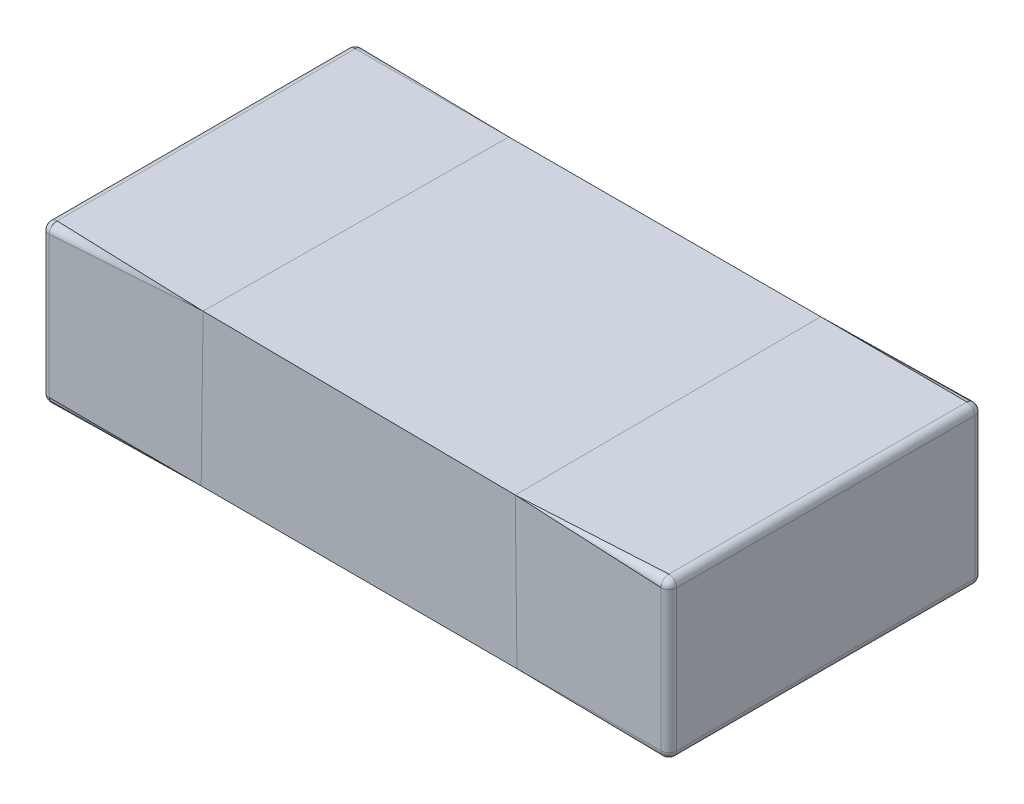
ISO-10303-21;
HEADER;
FILE_DESCRIPTION(('STEP AP214'),'2;1');
FILE_NAME('part.step','',(''),(''),'','','');
FILE_SCHEMA(('AUTOMOTIVE_DESIGN { 1 0 10303 214 1 1 1 1 }'));
ENDSEC;
DATA;
#1=APPLICATION_CONTEXT('core data for automotive mechanical design processes');
#2=APPLICATION_PROTOCOL_DEFINITION('international standard','automotive_design',2000,#1);
#3=PRODUCT_CONTEXT('',#1,'mechanical');
#4=PRODUCT('Part','Part','',(#3));
#5=PRODUCT_RELATED_PRODUCT_CATEGORY('part','',(#4));
#6=PRODUCT_DEFINITION_FORMATION('','',#4);
#7=PRODUCT_DEFINITION_CONTEXT('part definition',#1,'design');
#8=PRODUCT_DEFINITION('design','',#6,#7);
#9=PRODUCT_DEFINITION_SHAPE('','',#8);
#10=(LENGTH_UNIT() NAMED_UNIT(*) SI_UNIT(.MILLI.,.METRE.));
#11=(NAMED_UNIT(*) PLANE_ANGLE_UNIT() SI_UNIT($,.RADIAN.));
#12=(NAMED_UNIT(*) SI_UNIT($,.STERADIAN.) SOLID_ANGLE_UNIT());
#13=UNCERTAINTY_MEASURE_WITH_UNIT(LENGTH_MEASURE(1.E-05),#10,'distance_accuracy_value','');
#14=(GEOMETRIC_REPRESENTATION_CONTEXT(3) GLOBAL_UNCERTAINTY_ASSIGNED_CONTEXT((#13)) GLOBAL_UNIT_ASSIGNED_CONTEXT((#10,
#11,#12)) REPRESENTATION_CONTEXT('',''));
#15=CARTESIAN_POINT('',(0.,0.,0.));
#16=DIRECTION('',(0.,0.,1.));
#17=DIRECTION('',(1.,0.,0.));
#18=AXIS2_PLACEMENT_3D('',#15,#16,#17);
#19=CARTESIAN_POINT('',(0.4,0.,0.));
#20=DIRECTION('',(0.,0.,-1.));
#21=DIRECTION('',(-1.,0.,0.));
#22=AXIS2_PLACEMENT_3D('',#19,#20,#21);
#23=PLANE('',#22);
#24=DIRECTION('',(0.,-1.,0.));
#25=VECTOR('',#24,1.);
#26=CARTESIAN_POINT('',(0.02,0.,0.));
#27=LINE('',#26,#25);
#28=CARTESIAN_POINT('',(0.02,0.38,0.));
#29=VERTEX_POINT('',#28);
#30=CARTESIAN_POINT('',(0.02,0.02,0.));
#31=VERTEX_POINT('',#30);
#32=EDGE_CURVE('E11',#29,#31,#27,.T.);
#33=ORIENTED_EDGE('',*,*,#32,.T.);
#34=DIRECTION('',(1.,0.,0.));
#35=VECTOR('',#34,1.);
#36=CARTESIAN_POINT('',(0.4,0.02,0.));
#37=LINE('',#36,#35);
#38=CARTESIAN_POINT('',(0.4,0.0109819967589767,-0.00744806470428807));
#39=VERTEX_POINT('',#38);
#40=EDGE_CURVE('E25',#31,#39,#37,.T.);
#41=ORIENTED_EDGE('',*,*,#40,.T.);
#42=CARTESIAN_POINT('',(0.4,0.394533907643487,-0.00678606963199358));
#43=CARTESIAN_POINT('',(0.4,0.263741140957794,-0.00678606963199358));
#44=CARTESIAN_POINT('',(0.4,0.135397492272508,-0.00678606963199358));
#45=CARTESIAN_POINT('',(0.4,0.0109819967589767,-0.00678606963199358));
#46=B_SPLINE_CURVE_WITH_KNOTS('',3,(#42,#43,#44,#45),.UNSPECIFIED.,.F.,.F.,(4,4),(0.,1.),.UNSPECIFIED.);
#47=CARTESIAN_POINT('',(0.4,0.394533907643487,-0.0123095617266977));
#48=VERTEX_POINT('',#47);
#49=EDGE_CURVE('E522',#48,#39,#46,.T.);
#50=ORIENTED_EDGE('',*,*,#49,.F.);
#51=DIRECTION('',(-1.,0.,0.));
#52=VECTOR('',#51,1.);
#53=CARTESIAN_POINT('',(0.4,0.38,0.));
#54=LINE('',#53,#52);
#55=EDGE_CURVE('E37',#48,#29,#54,.T.);
#56=ORIENTED_EDGE('',*,*,#55,.T.);
#57=EDGE_LOOP('',(#33,#41,#50,#56));
#58=FACE_BOUND('',#57,.T.);
#59=ADVANCED_FACE('F17',(#58),#23,.F.);
#60=CARTESIAN_POINT('',(0.4,0.,0.));
#61=DIRECTION('',(0.,1.,0.));
#62=DIRECTION('',(0.,0.,1.));
#63=AXIS2_PLACEMENT_3D('',#60,#61,#62);
#64=PLANE('',#63);
#65=DIRECTION('',(0.,0.,-1.));
#66=VECTOR('',#65,1.);
#67=CARTESIAN_POINT('',(0.02,0.,-0.8));
#68=LINE('',#67,#66);
#69=CARTESIAN_POINT('',(0.02,0.,-0.02));
#70=VERTEX_POINT('',#69);
#71=CARTESIAN_POINT('',(0.02,0.,-0.78));
#72=VERTEX_POINT('',#71);
#73=EDGE_CURVE('E894',#70,#72,#68,.T.);
#74=ORIENTED_EDGE('',*,*,#73,.T.);
#75=DIRECTION('',(1.,0.,0.));
#76=VECTOR('',#75,1.);
#77=CARTESIAN_POINT('',(0.4,0.,-0.78));
#78=LINE('',#77,#76);
#79=CARTESIAN_POINT('',(0.4,0.00711261616325524,-0.78841510535834));
#80=VERTEX_POINT('',#79);
#81=EDGE_CURVE('E536',#72,#80,#78,.T.);
#82=ORIENTED_EDGE('',*,*,#81,.T.);
#83=CARTESIAN_POINT('',(0.4,0.00705384358722266,-0.00744806470428807));
#84=CARTESIAN_POINT('',(0.4,0.00705384358722266,-0.268354445364198));
#85=CARTESIAN_POINT('',(0.4,0.00705384358722266,-0.529922821096402));
#86=CARTESIAN_POINT('',(0.4,0.00705384358722266,-0.78841510535834));
#87=B_SPLINE_CURVE_WITH_KNOTS('',3,(#83,#84,#85,#86),.UNSPECIFIED.,.F.,.F.,(4,4),(0.,1.),.UNSPECIFIED.);
#88=EDGE_CURVE('E530',#39,#80,#87,.T.);
#89=ORIENTED_EDGE('',*,*,#88,.F.);
#90=DIRECTION('',(-1.,0.,0.));
#91=VECTOR('',#90,1.);
#92=CARTESIAN_POINT('',(0.4,0.,-0.02));
#93=LINE('',#92,#91);
#94=EDGE_CURVE('E524',#39,#70,#93,.T.);
#95=ORIENTED_EDGE('',*,*,#94,.T.);
#96=EDGE_LOOP('',(#74,#82,#89,#95));
#97=FACE_BOUND('',#96,.T.);
#98=ADVANCED_FACE('F335',(#97),#64,.F.);
#99=CARTESIAN_POINT('',(0.4,0.,-0.8));
#100=DIRECTION('',(0.,0.,1.));
#101=DIRECTION('',(1.,0.,0.));
#102=AXIS2_PLACEMENT_3D('',#99,#100,#101);
#103=PLANE('',#102);
#104=DIRECTION('',(0.,1.,0.));
#105=VECTOR('',#104,1.);
#106=CARTESIAN_POINT('',(0.02,0.4,-0.8));
#107=LINE('',#106,#105);
#108=CARTESIAN_POINT('',(0.02,0.02,-0.8));
#109=VERTEX_POINT('',#108);
#110=CARTESIAN_POINT('',(0.02,0.38,-0.8));
#111=VERTEX_POINT('',#110);
#112=EDGE_CURVE('E531',#109,#111,#107,.T.);
#113=ORIENTED_EDGE('',*,*,#112,.T.);
#114=DIRECTION('',(1.,0.,0.));
#115=VECTOR('',#114,1.);
#116=CARTESIAN_POINT('',(0.4,0.38,-0.8));
#117=LINE('',#116,#115);
#118=CARTESIAN_POINT('',(0.4,0.389276094232919,-0.792025572215316));
#119=VERTEX_POINT('',#118);
#120=EDGE_CURVE('E921',#111,#119,#117,.T.);
#121=ORIENTED_EDGE('',*,*,#120,.T.);
#122=CARTESIAN_POINT('',(0.4,0.00711261616325522,-0.791491196828607));
#123=CARTESIAN_POINT('',(0.4,0.135397492272508,-0.791491196828607));
#124=CARTESIAN_POINT('',(0.4,0.263741140957794,-0.791491196828607));
#125=CARTESIAN_POINT('',(0.4,0.389276094232919,-0.791491196828607));
#126=B_SPLINE_CURVE_WITH_KNOTS('',3,(#122,#123,#124,#125),.UNSPECIFIED.,.F.,.F.,(4,4),(0.,1.),.UNSPECIFIED.);
#127=EDGE_CURVE('E353',#80,#119,#126,.T.);
#128=ORIENTED_EDGE('',*,*,#127,.F.);
#129=DIRECTION('',(-1.,0.,0.));
#130=VECTOR('',#129,1.);
#131=CARTESIAN_POINT('',(0.4,0.02,-0.8));
#132=LINE('',#131,#130);
#133=EDGE_CURVE('E343',#80,#109,#132,.T.);
#134=ORIENTED_EDGE('',*,*,#133,.T.);
#135=EDGE_LOOP('',(#113,#121,#128,#134));
#136=FACE_BOUND('',#135,.T.);
#137=ADVANCED_FACE('F330',(#136),#103,.F.);
#138=CARTESIAN_POINT('',(0.4,0.4,0.));
#139=DIRECTION('',(0.,-1.,0.));
#140=DIRECTION('',(0.,0.,-1.));
#141=AXIS2_PLACEMENT_3D('',#138,#139,#140);
#142=PLANE('',#141);
#143=CARTESIAN_POINT('',(0.4,0.39208478964308,-0.792025572215316));
#144=CARTESIAN_POINT('',(0.4,0.39208478964308,-0.529922821096402));
#145=CARTESIAN_POINT('',(0.4,0.39208478964308,-0.268354445364198));
#146=CARTESIAN_POINT('',(0.4,0.39208478964308,-0.0123095617266977));
#147=B_SPLINE_CURVE_WITH_KNOTS('',3,(#143,#144,#145,#146),.UNSPECIFIED.,.F.,.F.,(4,4),(0.,1.),.UNSPECIFIED.);
#148=EDGE_CURVE('E312',#119,#48,#147,.T.);
#149=ORIENTED_EDGE('',*,*,#148,.F.);
#150=DIRECTION('',(-1.,0.,0.));
#151=VECTOR('',#150,1.);
#152=CARTESIAN_POINT('',(0.4,0.4,-0.78));
#153=LINE('',#152,#151);
#154=CARTESIAN_POINT('',(0.02,0.4,-0.78));
#155=VERTEX_POINT('',#154);
#156=EDGE_CURVE('E307',#119,#155,#153,.T.);
#157=ORIENTED_EDGE('',*,*,#156,.T.);
#158=DIRECTION('',(0.,0.,1.));
#159=VECTOR('',#158,1.);
#160=CARTESIAN_POINT('',(0.02,0.4,0.));
#161=LINE('',#160,#159);
#162=CARTESIAN_POINT('',(0.02,0.4,-0.02));
#163=VERTEX_POINT('',#162);
#164=EDGE_CURVE('E304',#155,#163,#161,.T.);
#165=ORIENTED_EDGE('',*,*,#164,.T.);
#166=DIRECTION('',(1.,0.,0.));
#167=VECTOR('',#166,1.);
#168=CARTESIAN_POINT('',(0.4,0.4,-0.02));
#169=LINE('',#168,#167);
#170=EDGE_CURVE('E299',#163,#48,#169,.T.);
#171=ORIENTED_EDGE('',*,*,#170,.T.);
#172=EDGE_LOOP('',(#149,#157,#165,#171));
#173=FACE_BOUND('',#172,.T.);
#174=ADVANCED_FACE('F319',(#173),#142,.F.);
#175=CARTESIAN_POINT('',(0.,0.4,0.));
#176=DIRECTION('',(-1.,0.,0.));
#177=DIRECTION('',(0.,0.,1.));
#178=AXIS2_PLACEMENT_3D('',#175,#176,#177);
#179=PLANE('',#178);
#180=DIRECTION('',(0.,-1.,0.));
#181=VECTOR('',#180,1.);
#182=CARTESIAN_POINT('',(0.,0.,-0.78));
#183=LINE('',#182,#181);
#184=CARTESIAN_POINT('',(0.,0.38,-0.78));
#185=VERTEX_POINT('',#184);
#186=CARTESIAN_POINT('',(0.,0.02,-0.78));
#187=VERTEX_POINT('',#186);
#188=EDGE_CURVE('E297',#185,#187,#183,.T.);
#189=ORIENTED_EDGE('',*,*,#188,.T.);
#190=DIRECTION('',(0.,0.,1.));
#191=VECTOR('',#190,1.);
#192=CARTESIAN_POINT('',(0.,0.02,0.));
#193=LINE('',#192,#191);
#194=CARTESIAN_POINT('',(0.,0.02,-0.02));
#195=VERTEX_POINT('',#194);
#196=EDGE_CURVE('E295',#187,#195,#193,.T.);
#197=ORIENTED_EDGE('',*,*,#196,.T.);
#198=DIRECTION('',(0.,1.,0.));
#199=VECTOR('',#198,1.);
#200=CARTESIAN_POINT('',(0.,0.4,-0.02));
#201=LINE('',#200,#199);
#202=CARTESIAN_POINT('',(0.,0.38,-0.02));
#203=VERTEX_POINT('',#202);
#204=EDGE_CURVE('E293',#195,#203,#201,.T.);
#205=ORIENTED_EDGE('',*,*,#204,.T.);
#206=DIRECTION('',(0.,0.,-1.));
#207=VECTOR('',#206,1.);
#208=CARTESIAN_POINT('',(0.,0.38,-0.8));
#209=LINE('',#208,#207);
#210=EDGE_CURVE('E290',#203,#185,#209,.T.);
#211=ORIENTED_EDGE('',*,*,#210,.T.);
#212=EDGE_LOOP('',(#189,#197,#205,#211));
#213=FACE_BOUND('',#212,.T.);
#214=ADVANCED_FACE('F329',(#213),#179,.T.);
#215=CARTESIAN_POINT('',(1.2,0.39208478964308,-0.00678606963199358));
#216=DIRECTION('',(0.,0.,-1.));
#217=DIRECTION('',(-1.,0.,0.));
#218=AXIS2_PLACEMENT_3D('',#215,#216,#217);
#219=PLANE('',#218);
#220=ORIENTED_EDGE('',*,*,#49,.T.);
#221=DIRECTION('',(1.,0.,0.));
#222=VECTOR('',#221,1.);
#223=CARTESIAN_POINT('',(1.2,0.00705384358722266,-0.00678606963199358));
#224=LINE('',#223,#222);
#225=CARTESIAN_POINT('',(1.2,0.00469186962900822,-0.0126718520652537));
#226=VERTEX_POINT('',#225);
#227=EDGE_CURVE('E288',#39,#226,#224,.T.);
#228=ORIENTED_EDGE('',*,*,#227,.T.);
#229=CARTESIAN_POINT('',(1.2,0.390383185381512,0.));
#230=CARTESIAN_POINT('',(1.2,0.260255456921008,0.));
#231=CARTESIAN_POINT('',(1.2,0.130127728460504,0.));
#232=CARTESIAN_POINT('',(1.2,0.00469186962900821,0.));
#233=B_SPLINE_CURVE_WITH_KNOTS('',3,(#229,#230,#231,#232),.UNSPECIFIED.,.F.,.F.,(4,4),
(0.0240420365462188,1.),.UNSPECIFIED.);
#234=CARTESIAN_POINT('',(1.2,0.390383185381513,-0.008354983209375));
#235=VERTEX_POINT('',#234);
#236=EDGE_CURVE('E284',#235,#226,#233,.T.);
#237=ORIENTED_EDGE('',*,*,#236,.F.);
#238=DIRECTION('',(1.,0.,0.));
#239=VECTOR('',#238,1.);
#240=CARTESIAN_POINT('',(1.2,0.39208478964308,-0.00678606963199358));
#241=LINE('',#240,#239);
#242=EDGE_CURVE('E479',#48,#235,#241,.T.);
#243=ORIENTED_EDGE('',*,*,#242,.F.);
#244=EDGE_LOOP('',(#220,#228,#237,#243));
#245=FACE_BOUND('',#244,.T.);
#246=ADVANCED_FACE('F546',(#245),#219,.F.);
#247=CARTESIAN_POINT('',(1.2,0.00705384358722266,-0.00678606963199358));
#248=DIRECTION('',(0.,1.,0.));
#249=DIRECTION('',(0.,0.,1.));
#250=AXIS2_PLACEMENT_3D('',#247,#248,#249);
#251=PLANE('',#250);
#252=ORIENTED_EDGE('',*,*,#88,.T.);
#253=DIRECTION('',(1.,0.,0.));
#254=VECTOR('',#253,1.);
#255=CARTESIAN_POINT('',(1.2,0.00705384358722266,-0.791491196828607));
#256=LINE('',#255,#254);
#257=CARTESIAN_POINT('',(1.2,0.0120541829757779,-0.794263770148656));
#258=VERTEX_POINT('',#257);
#259=EDGE_CURVE('E571',#80,#258,#256,.T.);
#260=ORIENTED_EDGE('',*,*,#259,.T.);
#261=CARTESIAN_POINT('',(1.2,0.,-0.0126718520652537));
#262=CARTESIAN_POINT('',(1.2,0.,-0.275114568043502));
#263=CARTESIAN_POINT('',(1.2,0.,-0.537557284021751));
#264=CARTESIAN_POINT('',(1.2,0.,-0.794263770148656));
#265=B_SPLINE_CURVE_WITH_KNOTS('',3,(#261,#262,#263,#264),.UNSPECIFIED.,.F.,.F.,(4,4),
(0.0158398150815671,1.),.UNSPECIFIED.);
#266=EDGE_CURVE('E542',#226,#258,#265,.T.);
#267=ORIENTED_EDGE('',*,*,#266,.F.);
#268=ORIENTED_EDGE('',*,*,#227,.F.);
#269=EDGE_LOOP('',(#252,#260,#267,#268));
#270=FACE_BOUND('',#269,.T.);
#271=ADVANCED_FACE('F368',(#270),#251,.F.);
#272=CARTESIAN_POINT('',(1.2,0.39208478964308,-0.791491196828607));
#273=DIRECTION('',(0.,0.,1.));
#274=DIRECTION('',(1.,0.,0.));
#275=AXIS2_PLACEMENT_3D('',#272,#273,#274);
#276=PLANE('',#275);
#277=ORIENTED_EDGE('',*,*,#127,.T.);
#278=DIRECTION('',(1.,0.,0.));
#279=VECTOR('',#278,1.);
#280=CARTESIAN_POINT('',(1.2,0.39208478964308,-0.791491196828607));
#281=LINE('',#280,#279);
#282=CARTESIAN_POINT('',(1.2,0.394661993524652,-0.787285732941527));
#283=VERTEX_POINT('',#282);
#284=EDGE_CURVE('E477',#119,#283,#281,.T.);
#285=ORIENTED_EDGE('',*,*,#284,.T.);
#286=CARTESIAN_POINT('',(1.2,0.0120541829757779,-0.8));
#287=CARTESIAN_POINT('',(1.2,0.141369455317185,-0.8));
#288=CARTESIAN_POINT('',(1.2,0.270684727658593,-0.8));
#289=CARTESIAN_POINT('',(1.2,0.394661993524652,-0.8));
#290=B_SPLINE_CURVE_WITH_KNOTS('',3,(#286,#287,#288,#289),.UNSPECIFIED.,.F.,.F.,(4,4),
(0.0301354574394448,1.),.UNSPECIFIED.);
#291=EDGE_CURVE('E387',#258,#283,#290,.T.);
#292=ORIENTED_EDGE('',*,*,#291,.F.);
#293=ORIENTED_EDGE('',*,*,#259,.F.);
#294=EDGE_LOOP('',(#277,#285,#292,#293));
#295=FACE_BOUND('',#294,.T.);
#296=ADVANCED_FACE('F359',(#295),#276,.F.);
#297=CARTESIAN_POINT('',(1.2,0.39208478964308,-0.00678606963199358));
#298=DIRECTION('',(0.,-1.,0.));
#299=DIRECTION('',(0.,0.,-1.));
#300=AXIS2_PLACEMENT_3D('',#297,#298,#299);
#301=PLANE('',#300);
#302=CARTESIAN_POINT('',(1.2,0.4,-0.787285732941527));
#303=CARTESIAN_POINT('',(1.2,0.4,-0.527642149697477));
#304=CARTESIAN_POINT('',(1.2,0.4,-0.267998566453426));
#305=CARTESIAN_POINT('',(1.2,0.4,-0.008354983209375));
#306=B_SPLINE_CURVE_WITH_KNOTS('',3,(#302,#303,#304,#305),.UNSPECIFIED.,.F.,.F.,(4,4),
(0.015892833823091,0.989556270988281),.UNSPECIFIED.);
#307=EDGE_CURVE('E458',#283,#235,#306,.T.);
#308=ORIENTED_EDGE('',*,*,#307,.F.);
#309=ORIENTED_EDGE('',*,*,#284,.F.);
#310=ORIENTED_EDGE('',*,*,#148,.T.);
#311=ORIENTED_EDGE('',*,*,#242,.T.);
#312=EDGE_LOOP('',(#308,#309,#310,#311));
#313=FACE_BOUND('',#312,.T.);
#314=ADVANCED_FACE('F263',(#313),#301,.F.);
#315=CARTESIAN_POINT('',(1.6,0.4,0.));
#316=DIRECTION('',(0.,0.,-1.));
#317=DIRECTION('',(-1.,0.,0.));
#318=AXIS2_PLACEMENT_3D('',#315,#316,#317);
#319=PLANE('',#318);
#320=ORIENTED_EDGE('',*,*,#236,.T.);
#321=DIRECTION('',(1.,0.,0.));
#322=VECTOR('',#321,1.);
#323=CARTESIAN_POINT('',(1.6,0.02,0.));
#324=LINE('',#323,#322);
#325=CARTESIAN_POINT('',(1.58,0.02,0.));
#326=VERTEX_POINT('',#325);
#327=EDGE_CURVE('E456',#226,#326,#324,.T.);
#328=ORIENTED_EDGE('',*,*,#327,.T.);
#329=DIRECTION('',(0.,1.,0.));
#330=VECTOR('',#329,1.);
#331=CARTESIAN_POINT('',(1.58,0.4,0.));
#332=LINE('',#331,#330);
#333=CARTESIAN_POINT('',(1.58,0.38,0.));
#334=VERTEX_POINT('',#333);
#335=EDGE_CURVE('E455',#326,#334,#332,.T.);
#336=ORIENTED_EDGE('',*,*,#335,.T.);
#337=CARTESIAN_POINT('',(1.58,0.38,0.));
#338=DIRECTION('',(-1.,0.,0.));
#339=VECTOR('',#338,1.);
#340=LINE('',#337,#339);
#341=EDGE_CURVE('E245',#334,#235,#340,.T.);
#342=ORIENTED_EDGE('',*,*,#341,.T.);
#343=EDGE_LOOP('',(#320,#328,#336,#342));
#344=FACE_BOUND('',#343,.T.);
#345=ADVANCED_FACE('F252',(#344),#319,.F.);
#346=CARTESIAN_POINT('',(1.6,0.,0.));
#347=DIRECTION('',(0.,1.,0.));
#348=DIRECTION('',(0.,0.,1.));
#349=AXIS2_PLACEMENT_3D('',#346,#347,#348);
#350=PLANE('',#349);
#351=ORIENTED_EDGE('',*,*,#266,.T.);
#352=DIRECTION('',(1.,0.,0.));
#353=VECTOR('',#352,1.);
#354=CARTESIAN_POINT('',(1.6,0.,-0.78));
#355=LINE('',#354,#353);
#356=CARTESIAN_POINT('',(1.58,0.,-0.78));
#357=VERTEX_POINT('',#356);
#358=EDGE_CURVE('E236',#258,#357,#355,.T.);
#359=ORIENTED_EDGE('',*,*,#358,.T.);
#360=DIRECTION('',(0.,0.,1.));
#361=VECTOR('',#360,1.);
#362=CARTESIAN_POINT('',(1.58,0.,0.));
#363=LINE('',#362,#361);
#364=CARTESIAN_POINT('',(1.58,0.,-0.02));
#365=VERTEX_POINT('',#364);
#366=EDGE_CURVE('E448',#357,#365,#363,.T.);
#367=ORIENTED_EDGE('',*,*,#366,.T.);
#368=DIRECTION('',(-1.,0.,0.));
#369=VECTOR('',#368,1.);
#370=CARTESIAN_POINT('',(1.6,0.,-0.02));
#371=LINE('',#370,#369);
#372=EDGE_CURVE('E443',#365,#226,#371,.T.);
#373=ORIENTED_EDGE('',*,*,#372,.T.);
#374=EDGE_LOOP('',(#351,#359,#367,#373));
#375=FACE_BOUND('',#374,.T.);
#376=ADVANCED_FACE('F262',(#375),#350,.F.);
#377=CARTESIAN_POINT('',(1.6,0.4,-0.8));
#378=DIRECTION('',(0.,0.,1.));
#379=DIRECTION('',(1.,0.,0.));
#380=AXIS2_PLACEMENT_3D('',#377,#378,#379);
#381=PLANE('',#380);
#382=ORIENTED_EDGE('',*,*,#291,.T.);
#383=DIRECTION('',(1.,0.,0.));
#384=VECTOR('',#383,1.);
#385=CARTESIAN_POINT('',(1.6,0.38,-0.8));
#386=LINE('',#385,#384);
#387=CARTESIAN_POINT('',(1.58,0.38,-0.8));
#388=VERTEX_POINT('',#387);
#389=EDGE_CURVE('E438',#283,#388,#386,.T.);
#390=ORIENTED_EDGE('',*,*,#389,.T.);
#391=DIRECTION('',(0.,-1.,0.));
#392=VECTOR('',#391,1.);
#393=CARTESIAN_POINT('',(1.58,0.,-0.8));
#394=LINE('',#393,#392);
#395=CARTESIAN_POINT('',(1.58,0.02,-0.8));
#396=VERTEX_POINT('',#395);
#397=EDGE_CURVE('E435',#388,#396,#394,.T.);
#398=ORIENTED_EDGE('',*,*,#397,.T.);
#399=DIRECTION('',(-1.,0.,0.));
#400=VECTOR('',#399,1.);
#401=CARTESIAN_POINT('',(1.6,0.02,-0.8));
#402=LINE('',#401,#400);
#403=EDGE_CURVE('E430',#396,#258,#402,.T.);
#404=ORIENTED_EDGE('',*,*,#403,.T.);
#405=EDGE_LOOP('',(#382,#390,#398,#404));
#406=FACE_BOUND('',#405,.T.);
#407=ADVANCED_FACE('F393',(#406),#381,.F.);
#408=CARTESIAN_POINT('',(1.6,0.4,0.));
#409=DIRECTION('',(0.,-1.,0.));
#410=DIRECTION('',(0.,0.,-1.));
#411=AXIS2_PLACEMENT_3D('',#408,#409,#410);
#412=PLANE('',#411);
#413=DIRECTION('',(0.,0.,-1.));
#414=VECTOR('',#413,1.);
#415=CARTESIAN_POINT('',(1.58,0.4,-0.8));
#416=LINE('',#415,#414);
#417=CARTESIAN_POINT('',(1.58,0.4,-0.02));
#418=VERTEX_POINT('',#417);
#419=CARTESIAN_POINT('',(1.58,0.4,-0.78));
#420=VERTEX_POINT('',#419);
#421=EDGE_CURVE('E164',#418,#420,#416,.T.);
#422=ORIENTED_EDGE('',*,*,#421,.T.);
#423=DIRECTION('',(-1.,0.,0.));
#424=VECTOR('',#423,1.);
#425=CARTESIAN_POINT('',(1.6,0.4,-0.78));
#426=LINE('',#425,#424);
#427=EDGE_CURVE('E424',#420,#283,#426,.T.);
#428=ORIENTED_EDGE('',*,*,#427,.T.);
#429=ORIENTED_EDGE('',*,*,#307,.T.);
#430=CARTESIAN_POINT('',(1.2,0.4,-0.02));
#431=DIRECTION('',(1.,0.,0.));
#432=VECTOR('',#431,1.);
#433=LINE('',#430,#432);
#434=EDGE_CURVE('E209',#235,#418,#433,.T.);
#435=ORIENTED_EDGE('',*,*,#434,.T.);
#436=EDGE_LOOP('',(#422,#428,#429,#435));
#437=FACE_BOUND('',#436,.T.);
#438=ADVANCED_FACE('F402',(#437),#412,.F.);
#439=CARTESIAN_POINT('',(1.6,0.,0.));
#440=DIRECTION('',(1.,0.,0.));
#441=DIRECTION('',(0.,0.,-1.));
#442=AXIS2_PLACEMENT_3D('',#439,#440,#441);
#443=PLANE('',#442);
#444=DIRECTION('',(0.,0.,-1.));
#445=VECTOR('',#444,1.);
#446=CARTESIAN_POINT('',(1.6,0.02,-0.8));
#447=LINE('',#446,#445);
#448=CARTESIAN_POINT('',(1.6,0.02,-0.02));
#449=VERTEX_POINT('',#448);
#450=CARTESIAN_POINT('',(1.6,0.02,-0.78));
#451=VERTEX_POINT('',#450);
#452=EDGE_CURVE('E207',#449,#451,#447,.T.);
#453=ORIENTED_EDGE('',*,*,#452,.T.);
#454=DIRECTION('',(0.,1.,0.));
#455=VECTOR('',#454,1.);
#456=CARTESIAN_POINT('',(1.6,0.4,-0.78));
#457=LINE('',#456,#455);
#458=CARTESIAN_POINT('',(1.6,0.38,-0.78));
#459=VERTEX_POINT('',#458);
#460=EDGE_CURVE('E136',#451,#459,#457,.T.);
#461=ORIENTED_EDGE('',*,*,#460,.T.);
#462=DIRECTION('',(0.,0.,1.));
#463=VECTOR('',#462,1.);
#464=CARTESIAN_POINT('',(1.6,0.38,0.));
#465=LINE('',#464,#463);
#466=CARTESIAN_POINT('',(1.6,0.38,-0.02));
#467=VERTEX_POINT('',#466);
#468=EDGE_CURVE('E130',#459,#467,#465,.T.);
#469=ORIENTED_EDGE('',*,*,#468,.T.);
#470=DIRECTION('',(0.,-1.,0.));
#471=VECTOR('',#470,1.);
#472=CARTESIAN_POINT('',(1.6,0.,-0.02));
#473=LINE('',#472,#471);
#474=EDGE_CURVE('E133',#467,#449,#473,.T.);
#475=ORIENTED_EDGE('',*,*,#474,.T.);
#476=EDGE_LOOP('',(#453,#461,#469,#475));
#477=FACE_BOUND('',#476,.T.);
#478=ADVANCED_FACE('F132',(#477),#443,.T.);
#479=CARTESIAN_POINT('',(0.02,0.38,0.));
#480=DIRECTION('',(0.,0.,-1.));
#481=DIRECTION('',(-1.,0.,0.));
#482=AXIS2_PLACEMENT_3D('',#479,#480,#481);
#483=CYLINDRICAL_SURFACE('',#482,0.02);
#484=ORIENTED_EDGE('',*,*,#164,.F.);
#485=CARTESIAN_POINT('',(0.02,0.38,-0.78));
#486=DIRECTION('',(0.,0.,1.));
#487=DIRECTION('',(-1.,0.,0.));
#488=AXIS2_PLACEMENT_3D('',#485,#486,#487);
#489=CIRCLE('',#488,0.02);
#490=EDGE_CURVE('E151',#155,#185,#489,.T.);
#491=ORIENTED_EDGE('',*,*,#490,.T.);
#492=ORIENTED_EDGE('',*,*,#210,.F.);
#493=CARTESIAN_POINT('',(0.02,0.38,-0.02));
#494=DIRECTION('',(0.,0.,-1.));
#495=DIRECTION('',(-1.,0.,0.));
#496=AXIS2_PLACEMENT_3D('',#493,#494,#495);
#497=CIRCLE('',#496,0.02);
#498=EDGE_CURVE('E201',#203,#163,#497,.T.);
#499=ORIENTED_EDGE('',*,*,#498,.T.);
#500=EDGE_LOOP('',(#484,#491,#492,#499));
#501=FACE_BOUND('',#500,.T.);
#502=ADVANCED_FACE('F685',(#501),#483,.T.);
#503=CARTESIAN_POINT('',(0.02,0.,-0.02));
#504=DIRECTION('',(0.,1.,0.));
#505=DIRECTION('',(0.,0.,1.));
#506=AXIS2_PLACEMENT_3D('',#503,#504,#505);
#507=CYLINDRICAL_SURFACE('',#506,0.02);
#508=ORIENTED_EDGE('',*,*,#204,.F.);
#509=CARTESIAN_POINT('',(0.02,0.02,-0.02));
#510=DIRECTION('',(0.,1.,0.));
#511=DIRECTION('',(0.,0.,1.));
#512=AXIS2_PLACEMENT_3D('',#509,#510,#511);
#513=CIRCLE('',#512,0.02);
#514=EDGE_CURVE('E198',#195,#31,#513,.T.);
#515=ORIENTED_EDGE('',*,*,#514,.T.);
#516=ORIENTED_EDGE('',*,*,#32,.F.);
#517=CARTESIAN_POINT('',(0.02,0.38,-0.02));
#518=DIRECTION('',(0.,-1.,0.));
#519=DIRECTION('',(0.,0.,1.));
#520=AXIS2_PLACEMENT_3D('',#517,#518,#519);
#521=CIRCLE('',#520,0.02);
#522=EDGE_CURVE('E195',#29,#203,#521,.T.);
#523=ORIENTED_EDGE('',*,*,#522,.T.);
#524=EDGE_LOOP('',(#508,#515,#516,#523));
#525=FACE_BOUND('',#524,.T.);
#526=ADVANCED_FACE('F519',(#525),#507,.T.);
#527=CARTESIAN_POINT('',(0.02,0.,-0.78));
#528=DIRECTION('',(0.,-1.,0.));
#529=DIRECTION('',(0.,0.,-1.));
#530=AXIS2_PLACEMENT_3D('',#527,#528,#529);
#531=CYLINDRICAL_SURFACE('',#530,0.0200000000000001);
#532=ORIENTED_EDGE('',*,*,#188,.F.);
#533=CARTESIAN_POINT('',(0.02,0.38,-0.78));
#534=DIRECTION('',(0.,-1.,0.));
#535=DIRECTION('',(0.,0.,-1.));
#536=AXIS2_PLACEMENT_3D('',#533,#534,#535);
#537=CIRCLE('',#536,0.0200000000000001);
#538=EDGE_CURVE('E192',#185,#111,#537,.T.);
#539=ORIENTED_EDGE('',*,*,#538,.T.);
#540=ORIENTED_EDGE('',*,*,#112,.F.);
#541=CARTESIAN_POINT('',(0.02,0.02,-0.78));
#542=DIRECTION('',(0.,1.,0.));
#543=DIRECTION('',(0.,0.,-1.));
#544=AXIS2_PLACEMENT_3D('',#541,#542,#543);
#545=CIRCLE('',#544,0.0200000000000001);
#546=EDGE_CURVE('E189',#109,#187,#545,.T.);
#547=ORIENTED_EDGE('',*,*,#546,.T.);
#548=EDGE_LOOP('',(#532,#539,#540,#547));
#549=FACE_BOUND('',#548,.T.);
#550=ADVANCED_FACE('F701',(#549),#531,.T.);
#551=CARTESIAN_POINT('',(0.02,0.02,0.));
#552=DIRECTION('',(0.,0.,1.));
#553=DIRECTION('',(1.,0.,0.));
#554=AXIS2_PLACEMENT_3D('',#551,#552,#553);
#555=CYLINDRICAL_SURFACE('',#554,0.02);
#556=ORIENTED_EDGE('',*,*,#196,.F.);
#557=CARTESIAN_POINT('',(0.02,0.02,-0.78));
#558=DIRECTION('',(0.,0.,1.));
#559=DIRECTION('',(1.,0.,0.));
#560=AXIS2_PLACEMENT_3D('',#557,#558,#559);
#561=CIRCLE('',#560,0.02);
#562=EDGE_CURVE('E186',#187,#72,#561,.T.);
#563=ORIENTED_EDGE('',*,*,#562,.T.);
#564=ORIENTED_EDGE('',*,*,#73,.F.);
#565=CARTESIAN_POINT('',(0.02,0.02,-0.02));
#566=DIRECTION('',(0.,0.,-1.));
#567=DIRECTION('',(1.,0.,0.));
#568=AXIS2_PLACEMENT_3D('',#565,#566,#567);
#569=CIRCLE('',#568,0.02);
#570=EDGE_CURVE('E183',#70,#195,#569,.T.);
#571=ORIENTED_EDGE('',*,*,#570,.T.);
#572=EDGE_LOOP('',(#556,#563,#564,#571));
#573=FACE_BOUND('',#572,.T.);
#574=ADVANCED_FACE('F710',(#573),#555,.T.);
#575=CARTESIAN_POINT('',(1.58,0.,-0.02));
#576=DIRECTION('',(0.,1.,0.));
#577=DIRECTION('',(0.,0.,1.));
#578=AXIS2_PLACEMENT_3D('',#575,#576,#577);
#579=CYLINDRICAL_SURFACE('',#578,0.02);
#580=ORIENTED_EDGE('',*,*,#335,.F.);
#581=CARTESIAN_POINT('',(1.58,0.02,-0.02));
#582=DIRECTION('',(0.,1.,0.));
#583=DIRECTION('',(0.,0.,1.));
#584=AXIS2_PLACEMENT_3D('',#581,#582,#583);
#585=CIRCLE('',#584,0.02);
#586=EDGE_CURVE('E149',#326,#449,#585,.T.);
#587=ORIENTED_EDGE('',*,*,#586,.T.);
#588=ORIENTED_EDGE('',*,*,#474,.F.);
#589=CARTESIAN_POINT('',(1.58,0.38,-0.02));
#590=DIRECTION('',(0.,-1.,0.));
#591=DIRECTION('',(0.,0.,1.));
#592=AXIS2_PLACEMENT_3D('',#589,#590,#591);
#593=CIRCLE('',#592,0.02);
#594=EDGE_CURVE('E146',#467,#334,#593,.T.);
#595=ORIENTED_EDGE('',*,*,#594,.T.);
#596=EDGE_LOOP('',(#580,#587,#588,#595));
#597=FACE_BOUND('',#596,.T.);
#598=ADVANCED_FACE('F145',(#597),#579,.T.);
#599=CARTESIAN_POINT('',(1.58,0.02,0.));
#600=DIRECTION('',(0.,0.,1.));
#601=DIRECTION('',(1.,0.,0.));
#602=AXIS2_PLACEMENT_3D('',#599,#600,#601);
#603=CYLINDRICAL_SURFACE('',#602,0.0200000000000001);
#604=ORIENTED_EDGE('',*,*,#366,.F.);
#605=CARTESIAN_POINT('',(1.58,0.02,-0.78));
#606=DIRECTION('',(0.,0.,1.));
#607=DIRECTION('',(1.,0.,0.));
#608=AXIS2_PLACEMENT_3D('',#605,#606,#607);
#609=CIRCLE('',#608,0.0200000000000001);
#610=EDGE_CURVE('E159',#357,#451,#609,.T.);
#611=ORIENTED_EDGE('',*,*,#610,.T.);
#612=ORIENTED_EDGE('',*,*,#452,.F.);
#613=CARTESIAN_POINT('',(1.58,0.02,-0.02));
#614=DIRECTION('',(0.,0.,-1.));
#615=DIRECTION('',(1.,0.,0.));
#616=AXIS2_PLACEMENT_3D('',#613,#614,#615);
#617=CIRCLE('',#616,0.0200000000000001);
#618=EDGE_CURVE('E168',#449,#365,#617,.T.);
#619=ORIENTED_EDGE('',*,*,#618,.T.);
#620=EDGE_LOOP('',(#604,#611,#612,#619));
#621=FACE_BOUND('',#620,.T.);
#622=ADVANCED_FACE('F602',(#621),#603,.T.);
#623=CARTESIAN_POINT('',(1.58,0.38,0.));
#624=DIRECTION('',(0.,0.,-1.));
#625=DIRECTION('',(-1.,0.,0.));
#626=AXIS2_PLACEMENT_3D('',#623,#624,#625);
#627=CYLINDRICAL_SURFACE('',#626,0.0200000000000001);
#628=ORIENTED_EDGE('',*,*,#468,.F.);
#629=CARTESIAN_POINT('',(1.58,0.38,-0.78));
#630=DIRECTION('',(0.,0.,1.));
#631=DIRECTION('',(-1.,0.,0.));
#632=AXIS2_PLACEMENT_3D('',#629,#630,#631);
#633=CIRCLE('',#632,0.0200000000000001);
#634=EDGE_CURVE('E165',#459,#420,#633,.T.);
#635=ORIENTED_EDGE('',*,*,#634,.T.);
#636=ORIENTED_EDGE('',*,*,#421,.F.);
#637=CARTESIAN_POINT('',(1.58,0.38,-0.02));
#638=DIRECTION('',(0.,0.,-1.));
#639=DIRECTION('',(-1.,0.,0.));
#640=AXIS2_PLACEMENT_3D('',#637,#638,#639);
#641=CIRCLE('',#640,0.0200000000000001);
#642=EDGE_CURVE('E156',#418,#467,#641,.T.);
#643=ORIENTED_EDGE('',*,*,#642,.T.);
#644=EDGE_LOOP('',(#628,#635,#636,#643));
#645=FACE_BOUND('',#644,.T.);
#646=ADVANCED_FACE('F162',(#645),#627,.T.);
#647=CARTESIAN_POINT('',(1.58,0.,-0.78));
#648=DIRECTION('',(0.,-1.,0.));
#649=DIRECTION('',(0.,0.,-1.));
#650=AXIS2_PLACEMENT_3D('',#647,#648,#649);
#651=CYLINDRICAL_SURFACE('',#650,0.0200000000000001);
#652=ORIENTED_EDGE('',*,*,#397,.F.);
#653=CARTESIAN_POINT('',(1.58,0.38,-0.78));
#654=DIRECTION('',(0.,-1.,0.));
#655=DIRECTION('',(0.,0.,-1.));
#656=AXIS2_PLACEMENT_3D('',#653,#654,#655);
#657=CIRCLE('',#656,0.0200000000000001);
#658=EDGE_CURVE('E166',#388,#459,#657,.T.);
#659=ORIENTED_EDGE('',*,*,#658,.T.);
#660=ORIENTED_EDGE('',*,*,#460,.F.);
#661=CARTESIAN_POINT('',(1.58,0.02,-0.78));
#662=DIRECTION('',(0.,1.,0.));
#663=DIRECTION('',(0.,0.,-1.));
#664=AXIS2_PLACEMENT_3D('',#661,#662,#663);
#665=CIRCLE('',#664,0.0200000000000001);
#666=EDGE_CURVE('E171',#451,#396,#665,.T.);
#667=ORIENTED_EDGE('',*,*,#666,.T.);
#668=EDGE_LOOP('',(#652,#659,#660,#667));
#669=FACE_BOUND('',#668,.T.);
#670=ADVANCED_FACE('F745',(#669),#651,.T.);
#671=CARTESIAN_POINT('',(1.58,0.38,-0.78));
#672=DIRECTION('',(0.,1.,0.));
#673=DIRECTION('',(1.,0.,0.));
#674=AXIS2_PLACEMENT_3D('',#671,#672,#673);
#675=SPHERICAL_SURFACE('',#674,0.02);
#676=CARTESIAN_POINT('',(1.58,0.38,-0.78));
#677=DIRECTION('',(1.,0.,0.));
#678=DIRECTION('',(0.,0.,-1.));
#679=AXIS2_PLACEMENT_3D('',#676,#677,#678);
#680=CIRCLE('',#679,0.0200000000000001);
#681=EDGE_CURVE('E484',#388,#420,#680,.T.);
#682=ORIENTED_EDGE('',*,*,#681,.T.);
#683=ORIENTED_EDGE('',*,*,#634,.F.);
#684=ORIENTED_EDGE('',*,*,#658,.F.);
#685=EDGE_LOOP('',(#682,#683,#684));
#686=FACE_BOUND('',#685,.T.);
#687=ADVANCED_FACE('F487',(#686),#675,.T.);
#688=CARTESIAN_POINT('',(1.6,0.38,-0.78));
#689=DIRECTION('',(-1.,0.,0.));
#690=DIRECTION('',(0.,0.,1.));
#691=AXIS2_PLACEMENT_3D('',#688,#689,#690);
#692=CYLINDRICAL_SURFACE('',#691,0.0200000000000001);
#693=ORIENTED_EDGE('',*,*,#389,.F.);
#694=ORIENTED_EDGE('',*,*,#427,.F.);
#695=ORIENTED_EDGE('',*,*,#681,.F.);
#696=EDGE_LOOP('',(#693,#694,#695));
#697=FACE_BOUND('',#696,.T.);
#698=ADVANCED_FACE('F482',(#697),#692,.T.);
#699=CARTESIAN_POINT('',(0.02,0.38,-0.78));
#700=DIRECTION('',(0.,1.,0.));
#701=DIRECTION('',(1.,0.,0.));
#702=AXIS2_PLACEMENT_3D('',#699,#700,#701);
#703=SPHERICAL_SURFACE('',#702,0.02);
#704=ORIENTED_EDGE('',*,*,#538,.F.);
#705=ORIENTED_EDGE('',*,*,#490,.F.);
#706=CARTESIAN_POINT('',(0.02,0.38,-0.78));
#707=DIRECTION('',(1.,0.,0.));
#708=DIRECTION('',(0.,0.,-1.));
#709=AXIS2_PLACEMENT_3D('',#706,#707,#708);
#710=CIRCLE('',#709,0.0200000000000001);
#711=EDGE_CURVE('E488',#111,#155,#710,.T.);
#712=ORIENTED_EDGE('',*,*,#711,.F.);
#713=EDGE_LOOP('',(#704,#705,#712));
#714=FACE_BOUND('',#713,.T.);
#715=ADVANCED_FACE('F771',(#714),#703,.T.);
#716=CARTESIAN_POINT('',(0.4,0.38,-0.78));
#717=DIRECTION('',(-1.,0.,0.));
#718=DIRECTION('',(0.,0.,1.));
#719=AXIS2_PLACEMENT_3D('',#716,#717,#718);
#720=CYLINDRICAL_SURFACE('',#719,0.0200000000000001);
#721=ORIENTED_EDGE('',*,*,#711,.T.);
#722=ORIENTED_EDGE('',*,*,#156,.F.);
#723=ORIENTED_EDGE('',*,*,#120,.F.);
#724=EDGE_LOOP('',(#721,#722,#723));
#725=FACE_BOUND('',#724,.T.);
#726=ADVANCED_FACE('F780',(#725),#720,.T.);
#727=CARTESIAN_POINT('',(1.58,0.02,-0.78));
#728=DIRECTION('',(0.,1.,0.));
#729=DIRECTION('',(1.,0.,0.));
#730=AXIS2_PLACEMENT_3D('',#727,#728,#729);
#731=SPHERICAL_SURFACE('',#730,0.02);
#732=ORIENTED_EDGE('',*,*,#666,.F.);
#733=ORIENTED_EDGE('',*,*,#610,.F.);
#734=CARTESIAN_POINT('',(1.58,0.02,-0.78));
#735=DIRECTION('',(1.,0.,0.));
#736=DIRECTION('',(0.,0.,-1.));
#737=AXIS2_PLACEMENT_3D('',#734,#735,#736);
#738=CIRCLE('',#737,0.0200000000000001);
#739=EDGE_CURVE('E493',#357,#396,#738,.T.);
#740=ORIENTED_EDGE('',*,*,#739,.T.);
#741=EDGE_LOOP('',(#732,#733,#740));
#742=FACE_BOUND('',#741,.T.);
#743=ADVANCED_FACE('F600',(#742),#731,.T.);
#744=CARTESIAN_POINT('',(1.6,0.02,-0.78));
#745=DIRECTION('',(-1.,0.,0.));
#746=DIRECTION('',(0.,0.,1.));
#747=AXIS2_PLACEMENT_3D('',#744,#745,#746);
#748=CYLINDRICAL_SURFACE('',#747,0.0200000000000001);
#749=ORIENTED_EDGE('',*,*,#358,.F.);
#750=ORIENTED_EDGE('',*,*,#403,.F.);
#751=ORIENTED_EDGE('',*,*,#739,.F.);
#752=EDGE_LOOP('',(#749,#750,#751));
#753=FACE_BOUND('',#752,.T.);
#754=ADVANCED_FACE('F597',(#753),#748,.T.);
#755=CARTESIAN_POINT('',(0.02,0.02,-0.78));
#756=DIRECTION('',(0.,1.,0.));
#757=DIRECTION('',(1.,0.,0.));
#758=AXIS2_PLACEMENT_3D('',#755,#756,#757);
#759=SPHERICAL_SURFACE('',#758,0.02);
#760=ORIENTED_EDGE('',*,*,#562,.F.);
#761=ORIENTED_EDGE('',*,*,#546,.F.);
#762=CARTESIAN_POINT('',(0.02,0.02,-0.78));
#763=DIRECTION('',(1.,0.,0.));
#764=DIRECTION('',(0.,0.,-1.));
#765=AXIS2_PLACEMENT_3D('',#762,#763,#764);
#766=CIRCLE('',#765,0.0200000000000001);
#767=EDGE_CURVE('E498',#72,#109,#766,.T.);
#768=ORIENTED_EDGE('',*,*,#767,.F.);
#769=EDGE_LOOP('',(#760,#761,#768));
#770=FACE_BOUND('',#769,.T.);
#771=ADVANCED_FACE('F807',(#770),#759,.T.);
#772=CARTESIAN_POINT('',(0.4,0.02,-0.78));
#773=DIRECTION('',(-1.,0.,0.));
#774=DIRECTION('',(0.,0.,1.));
#775=AXIS2_PLACEMENT_3D('',#772,#773,#774);
#776=CYLINDRICAL_SURFACE('',#775,0.0200000000000001);
#777=ORIENTED_EDGE('',*,*,#767,.T.);
#778=ORIENTED_EDGE('',*,*,#133,.F.);
#779=ORIENTED_EDGE('',*,*,#81,.F.);
#780=EDGE_LOOP('',(#777,#778,#779));
#781=FACE_BOUND('',#780,.T.);
#782=ADVANCED_FACE('F816',(#781),#776,.T.);
#783=CARTESIAN_POINT('',(1.58,0.02,-0.02));
#784=DIRECTION('',(0.,1.,0.));
#785=DIRECTION('',(1.,0.,0.));
#786=AXIS2_PLACEMENT_3D('',#783,#784,#785);
#787=SPHERICAL_SURFACE('',#786,0.02);
#788=ORIENTED_EDGE('',*,*,#618,.F.);
#789=ORIENTED_EDGE('',*,*,#586,.F.);
#790=CARTESIAN_POINT('',(1.58,0.02,-0.02));
#791=DIRECTION('',(1.,0.,0.));
#792=DIRECTION('',(0.,0.,-1.));
#793=AXIS2_PLACEMENT_3D('',#790,#791,#792);
#794=CIRCLE('',#793,0.02);
#795=EDGE_CURVE('E501',#326,#365,#794,.T.);
#796=ORIENTED_EDGE('',*,*,#795,.T.);
#797=EDGE_LOOP('',(#788,#789,#796));
#798=FACE_BOUND('',#797,.T.);
#799=ADVANCED_FACE('F605',(#798),#787,.T.);
#800=CARTESIAN_POINT('',(1.6,0.02,-0.02));
#801=DIRECTION('',(-1.,0.,0.));
#802=DIRECTION('',(0.,0.,1.));
#803=AXIS2_PLACEMENT_3D('',#800,#801,#802);
#804=CYLINDRICAL_SURFACE('',#803,0.02);
#805=ORIENTED_EDGE('',*,*,#327,.F.);
#806=ORIENTED_EDGE('',*,*,#372,.F.);
#807=ORIENTED_EDGE('',*,*,#795,.F.);
#808=EDGE_LOOP('',(#805,#806,#807));
#809=FACE_BOUND('',#808,.T.);
#810=ADVANCED_FACE('F607',(#809),#804,.T.);
#811=CARTESIAN_POINT('',(0.02,0.02,-0.02));
#812=DIRECTION('',(0.,1.,0.));
#813=DIRECTION('',(1.,0.,0.));
#814=AXIS2_PLACEMENT_3D('',#811,#812,#813);
#815=SPHERICAL_SURFACE('',#814,0.02);
#816=ORIENTED_EDGE('',*,*,#514,.F.);
#817=ORIENTED_EDGE('',*,*,#570,.F.);
#818=CARTESIAN_POINT('',(0.02,0.02,-0.02));
#819=DIRECTION('',(1.,0.,0.));
#820=DIRECTION('',(0.,0.,-1.));
#821=AXIS2_PLACEMENT_3D('',#818,#819,#820);
#822=CIRCLE('',#821,0.02);
#823=EDGE_CURVE('E504',#31,#70,#822,.T.);
#824=ORIENTED_EDGE('',*,*,#823,.F.);
#825=EDGE_LOOP('',(#816,#817,#824));
#826=FACE_BOUND('',#825,.T.);
#827=ADVANCED_FACE('F843',(#826),#815,.T.);
#828=CARTESIAN_POINT('',(0.4,0.02,-0.02));
#829=DIRECTION('',(-1.,0.,0.));
#830=DIRECTION('',(0.,0.,1.));
#831=AXIS2_PLACEMENT_3D('',#828,#829,#830);
#832=CYLINDRICAL_SURFACE('',#831,0.02);
#833=ORIENTED_EDGE('',*,*,#823,.T.);
#834=ORIENTED_EDGE('',*,*,#94,.F.);
#835=ORIENTED_EDGE('',*,*,#40,.F.);
#836=EDGE_LOOP('',(#833,#834,#835));
#837=FACE_BOUND('',#836,.T.);
#838=ADVANCED_FACE('F526',(#837),#832,.T.);
#839=CARTESIAN_POINT('',(1.58,0.38,-0.02));
#840=DIRECTION('',(0.,1.,0.));
#841=DIRECTION('',(1.,0.,0.));
#842=AXIS2_PLACEMENT_3D('',#839,#840,#841);
#843=SPHERICAL_SURFACE('',#842,0.02);
#844=CARTESIAN_POINT('',(1.58,0.38,-0.02));
#845=DIRECTION('',(1.,0.,0.));
#846=DIRECTION('',(0.,0.,-1.));
#847=AXIS2_PLACEMENT_3D('',#844,#845,#846);
#848=CIRCLE('',#847,0.02);
#849=EDGE_CURVE('E158',#418,#334,#848,.T.);
#850=ORIENTED_EDGE('',*,*,#849,.T.);
#851=ORIENTED_EDGE('',*,*,#594,.F.);
#852=ORIENTED_EDGE('',*,*,#642,.F.);
#853=EDGE_LOOP('',(#850,#851,#852));
#854=FACE_BOUND('',#853,.T.);
#855=ADVANCED_FACE('F155',(#854),#843,.T.);
#856=CARTESIAN_POINT('',(1.6,0.38,-0.02));
#857=DIRECTION('',(-1.,0.,0.));
#858=DIRECTION('',(0.,0.,1.));
#859=AXIS2_PLACEMENT_3D('',#856,#857,#858);
#860=CYLINDRICAL_SURFACE('',#859,0.02);
#861=ORIENTED_EDGE('',*,*,#434,.F.);
#862=ORIENTED_EDGE('',*,*,#341,.F.);
#863=ORIENTED_EDGE('',*,*,#849,.F.);
#864=EDGE_LOOP('',(#861,#862,#863));
#865=FACE_BOUND('',#864,.T.);
#866=ADVANCED_FACE('F216',(#865),#860,.T.);
#867=CARTESIAN_POINT('',(0.02,0.38,-0.02));
#868=DIRECTION('',(0.,1.,0.));
#869=DIRECTION('',(1.,0.,0.));
#870=AXIS2_PLACEMENT_3D('',#867,#868,#869);
#871=SPHERICAL_SURFACE('',#870,0.02);
#872=ORIENTED_EDGE('',*,*,#498,.F.);
#873=ORIENTED_EDGE('',*,*,#522,.F.);
#874=CARTESIAN_POINT('',(0.02,0.38,-0.02));
#875=DIRECTION('',(1.,0.,0.));
#876=DIRECTION('',(0.,0.,-1.));
#877=AXIS2_PLACEMENT_3D('',#874,#875,#876);
#878=CIRCLE('',#877,0.02);
#879=EDGE_CURVE('E507',#163,#29,#878,.T.);
#880=ORIENTED_EDGE('',*,*,#879,.F.);
#881=EDGE_LOOP('',(#872,#873,#880));
#882=FACE_BOUND('',#881,.T.);
#883=ADVANCED_FACE('F226',(#882),#871,.T.);
#884=CARTESIAN_POINT('',(0.4,0.38,-0.02));
#885=DIRECTION('',(-1.,0.,0.));
#886=DIRECTION('',(0.,0.,1.));
#887=AXIS2_PLACEMENT_3D('',#884,#885,#886);
#888=CYLINDRICAL_SURFACE('',#887,0.02);
#889=ORIENTED_EDGE('',*,*,#879,.T.);
#890=ORIENTED_EDGE('',*,*,#55,.F.);
#891=ORIENTED_EDGE('',*,*,#170,.F.);
#892=EDGE_LOOP('',(#889,#890,#891));
#893=FACE_BOUND('',#892,.T.);
#894=ADVANCED_FACE('F513',(#893),#888,.T.);
#895=CLOSED_SHELL('',(#59,#98,#137,#174,#214,#246,#271,#296,#314,#345,#376,#407,#438,#478,#502,
#526,#550,#574,#598,#622,#646,#670,#687,#698,#715,#726,#743,#754,#771,#782,#799,#810,#827,#838,
#855,#866,#883,#894));
#896=MANIFOLD_SOLID_BREP('B1',#895);
#897=ADVANCED_BREP_SHAPE_REPRESENTATION('',(#18,#896),#14);
#898=SHAPE_DEFINITION_REPRESENTATION(#9,#897);
ENDSEC;
END-ISO-10303-21;
